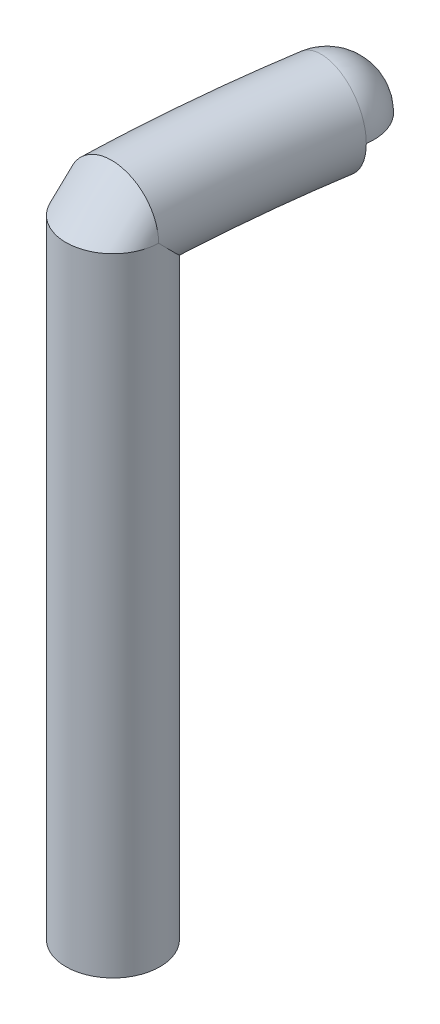
ISO-10303-21;
HEADER;
FILE_DESCRIPTION(('STEP AP214'),'2;1');
FILE_NAME('part.step','',(''),(''),'','','');
FILE_SCHEMA(('AUTOMOTIVE_DESIGN { 1 0 10303 214 1 1 1 1 }'));
ENDSEC;
DATA;
#1=APPLICATION_CONTEXT('core data for automotive mechanical design processes');
#2=APPLICATION_PROTOCOL_DEFINITION('international standard','automotive_design',2000,#1);
#3=PRODUCT_CONTEXT('',#1,'mechanical');
#4=PRODUCT('Part','Part','',(#3));
#5=PRODUCT_RELATED_PRODUCT_CATEGORY('part','',(#4));
#6=PRODUCT_DEFINITION_FORMATION('','',#4);
#7=PRODUCT_DEFINITION_CONTEXT('part definition',#1,'design');
#8=PRODUCT_DEFINITION('design','',#6,#7);
#9=PRODUCT_DEFINITION_SHAPE('','',#8);
#10=(LENGTH_UNIT() NAMED_UNIT(*) SI_UNIT(.MILLI.,.METRE.));
#11=(NAMED_UNIT(*) PLANE_ANGLE_UNIT() SI_UNIT($,.RADIAN.));
#12=(NAMED_UNIT(*) SI_UNIT($,.STERADIAN.) SOLID_ANGLE_UNIT());
#13=UNCERTAINTY_MEASURE_WITH_UNIT(LENGTH_MEASURE(1.E-05),#10,'distance_accuracy_value','');
#14=(GEOMETRIC_REPRESENTATION_CONTEXT(3) GLOBAL_UNCERTAINTY_ASSIGNED_CONTEXT((#13)) GLOBAL_UNIT_ASSIGNED_CONTEXT((#10,
#11,#12)) REPRESENTATION_CONTEXT('',''));
#15=CARTESIAN_POINT('',(0.,0.,0.));
#16=DIRECTION('',(0.,0.,1.));
#17=DIRECTION('',(1.,0.,0.));
#18=AXIS2_PLACEMENT_3D('',#15,#16,#17);
#19=CARTESIAN_POINT('',(0.,10.,0.));
#20=DIRECTION('',(0.,-1.,0.));
#21=DIRECTION('',(0.,0.,-1.));
#22=AXIS2_PLACEMENT_3D('',#19,#20,#21);
#23=CYLINDRICAL_SURFACE('',#22,1.5);
#24=CARTESIAN_POINT('',(-1.49938018439275,10.,-0.0431168487989805));
#25=CARTESIAN_POINT('',(-1.502973255126,10.,0.0818314999004156));
#26=CARTESIAN_POINT('',(-1.49184401753761,10.,0.223609989350335));
#27=CARTESIAN_POINT('',(-1.41111137182391,10.,0.533258564215563));
#28=CARTESIAN_POINT('',(-1.34072554100645,10.,0.701751397357321));
#29=CARTESIAN_POINT('',(-1.11002297258073,10.,1.02851786583561));
#30=CARTESIAN_POINT('',(-0.947978833180463,10.,1.18604361371794));
#31=CARTESIAN_POINT('',(-0.539291073540338,10.,1.41934085398787));
#32=CARTESIAN_POINT('',(-0.29301354619778,10.,1.49219404292625));
#33=CARTESIAN_POINT('',(0.206779848599801,10.,1.50656632585925));
#34=CARTESIAN_POINT('',(0.456836938236157,10.,1.44798595768824));
#35=CARTESIAN_POINT('',(0.878255855076445,10.,1.23855963716862));
#36=CARTESIAN_POINT('',(1.04908449294482,10.,1.09060612810616));
#37=CARTESIAN_POINT('',(1.29818358352478,10.,0.777637051243542));
#38=CARTESIAN_POINT('',(1.37813560586244,10.,0.61346740080803));
#39=CARTESIAN_POINT('',(1.4765289128442,10.,0.308969852145988));
#40=CARTESIAN_POINT('',(1.4957871136595,10.,0.168065197498395));
#41=CARTESIAN_POINT('',(1.49938018439275,10.,0.0431168487989986));
#42=B_SPLINE_CURVE_WITH_KNOTS('',3,(#24,#25,#26,#27,#28,#29,#30,#31,#32,#33,#34,#35,#36,#37,#38,
#39,#40,#41),.UNSPECIFIED.,.F.,.F.,(4,2,2,2,2,2,2,2,4),(0.,0.125,0.25,0.375,0.5,0.625,0.75,
0.875,1.),.UNSPECIFIED.);
#43=CARTESIAN_POINT('',(-1.49938018439275,10.,-0.0431168487989805));
#44=VERTEX_POINT('',#43);
#45=CARTESIAN_POINT('',(1.49938018439275,10.,0.0431168487989985));
#46=VERTEX_POINT('',#45);
#47=EDGE_CURVE('E12',#44,#46,#42,.T.);
#48=ORIENTED_EDGE('',*,*,#47,.F.);
#49=CARTESIAN_POINT('',(-1.49938018439275,10.,-0.0431168487989802));
#50=CARTESIAN_POINT('',(-1.49932652382973,9.99816086927018,-0.0449825910807266));
#51=CARTESIAN_POINT('',(-1.49926938794462,9.99632168364455,-0.0468482892103134));
#52=CARTESIAN_POINT('',(-1.49549142339636,9.88168256425837,-0.163133710811482));
#53=CARTESIAN_POINT('',(-1.4786974992958,9.76870382220539,-0.27735710822467));
#54=CARTESIAN_POINT('',(-1.41831838619842,9.5455356959307,-0.501936867428651));
#55=CARTESIAN_POINT('',(-1.37467520898276,9.43535288806064,-0.612284311273254));
#56=CARTESIAN_POINT('',(-1.27529661106114,9.25225172578073,-0.794424877009568));
#57=CARTESIAN_POINT('',(-1.22649407845322,9.1776225116601,-0.86828120790647));
#58=CARTESIAN_POINT('',(-1.11330591130869,9.03416044994391,-1.0093066300738));
#59=CARTESIAN_POINT('',(-1.04895554375433,8.96531495286826,-1.07649037682112));
#60=CARTESIAN_POINT('',(-0.922635796985833,8.85322260227896,-1.18480188848935));
#61=CARTESIAN_POINT('',(-0.864377072106044,8.80796739089892,-1.22816838688318));
#62=CARTESIAN_POINT('',(-0.738708495724694,8.72416563268223,-1.30759909134616));
#63=CARTESIAN_POINT('',(-0.671310295017772,8.68561068499964,-1.34367245102526));
#64=CARTESIAN_POINT('',(-0.542581246069168,8.62449516455373,-1.39981460654988));
#65=CARTESIAN_POINT('',(-0.482814321599226,8.60027628204208,-1.42164691269252));
#66=CARTESIAN_POINT('',(-0.358719315340889,8.55892977685502,-1.45790533565098));
#67=CARTESIAN_POINT('',(-0.294394346644171,8.54179736784932,-1.47233645294706));
#68=CARTESIAN_POINT('',(-0.16225959568242,8.51578950854917,-1.49270441045903));
#69=CARTESIAN_POINT('',(-0.0944284770467013,8.50697300779367,-1.49858076496475));
#70=CARTESIAN_POINT('',(0.0419642682140081,8.49864396585867,-1.50096045248283));
#71=CARTESIAN_POINT('',(0.110525506350655,8.49912670187407,-1.49746854413218));
#72=CARTESIAN_POINT('',(0.2381149962436,8.5088010184381,-1.48221380833435));
#73=CARTESIAN_POINT('',(0.297342637315855,8.51699883171821,-1.47143378339239));
#74=CARTESIAN_POINT('',(0.412820084821414,8.54015187544153,-1.44329929335211));
#75=CARTESIAN_POINT('',(0.469069448960498,8.55510810642843,-1.42594385486428));
#76=CARTESIAN_POINT('',(0.579457894315535,8.59157232798159,-1.38485587153756));
#77=CARTESIAN_POINT('',(0.633445022195836,8.61329952336927,-1.36091369248996));
#78=CARTESIAN_POINT('',(0.736365435096269,8.66200635163542,-1.30809723241815));
#79=CARTESIAN_POINT('',(0.785296152130478,8.68898863352949,-1.27922046484064));
#80=CARTESIAN_POINT('',(0.903155172535591,8.76310171805772,-1.20070960443533));
#81=CARTESIAN_POINT('',(0.96841770691637,8.81319048145329,-1.148349807482));
#82=CARTESIAN_POINT('',(1.08657806066911,8.92047800200151,-1.03728340316927));
#83=CARTESIAN_POINT('',(1.13944236255088,8.97769540645409,-0.978560204744381));
#84=CARTESIAN_POINT('',(1.2522117150946,9.12069106833198,-0.832772304338706));
#85=CARTESIAN_POINT('',(1.30657880704358,9.20878940463409,-0.74371198235814));
#86=CARTESIAN_POINT('',(1.39473135366095,9.39040017639781,-0.561249099107678));
#87=CARTESIAN_POINT('',(1.42850464628602,9.48391577549859,-0.467844006928321));
#88=CARTESIAN_POINT('',(1.47024065780035,9.64718595403276,-0.305475011407002));
#89=CARTESIAN_POINT('',(1.48277704079542,9.71628453884924,-0.236968577753659));
#90=CARTESIAN_POINT('',(1.49827347453524,9.85509642346358,-0.0996882903030317));
#91=CARTESIAN_POINT('',(1.50125060678697,9.92480840332783,-0.030915133615979));
#92=CARTESIAN_POINT('',(1.49948105705724,9.9963208481422,0.0394947072858357));
#93=CARTESIAN_POINT('',(1.49943225886567,9.99816044146853,0.0413058422906981));
#94=CARTESIAN_POINT('',(1.49938018439279,10.,0.0431168487989818));
#95=B_SPLINE_CURVE_WITH_KNOTS('',3,(#49,#50,#51,#52,#53,#54,#55,#56,#57,#58,#59,#60,#61,#62,#63,
#64,#65,#66,#67,#68,#69,#70,#71,#72,#73,#74,#75,#76,#77,#78,#79,#80,#81,#82,#83,#84,#85,#86,#87,
#88,#89,#90,#91,#92,#93,#94),.UNSPECIFIED.,.F.,.F.,(4,2,2,2,2,2,2,2,2,2,2,2,2,2,2,2,2,2,2,2,2,2,
4),(0.,0.00786130455138146,0.489993896622692,0.973171457872733,1.31940705152447,
1.66486453662568,1.92072982908381,2.17627196397468,2.37972143717495,2.58303327171022,
2.78777573828283,2.99241422500368,3.17384725207606,3.35530714803701,3.54339003226966,
3.73156797299757,4.02247655532376,4.31416274340212,4.72165875324494,5.12939518478898,
5.42328754323168,5.7166544497942,5.72440042274652),.UNSPECIFIED.);
#96=EDGE_CURVE('E77',#44,#46,#95,.T.);
#97=ORIENTED_EDGE('',*,*,#96,.T.);
#98=EDGE_LOOP('',(#48,#97));
#99=FACE_BOUND('',#98,.T.);
#100=CARTESIAN_POINT('',(0.,-10.,0.));
#101=DIRECTION('',(0.,1.,0.));
#102=DIRECTION('',(0.,0.,1.));
#103=AXIS2_PLACEMENT_3D('',#100,#101,#102);
#104=CIRCLE('',#103,1.5);
#105=CARTESIAN_POINT('',(0.,-10.,1.5));
#106=VERTEX_POINT('',#105);
#107=EDGE_CURVE('E50',#106,#106,#104,.T.);
#108=ORIENTED_EDGE('',*,*,#107,.T.);
#109=EDGE_LOOP('',(#108));
#110=FACE_BOUND('',#109,.T.);
#111=ADVANCED_FACE('F39',(#99,#110),#23,.T.);
#112=CARTESIAN_POINT('',(0.,-10.,0.));
#113=DIRECTION('',(0.,1.,0.));
#114=DIRECTION('',(0.,0.,1.));
#115=AXIS2_PLACEMENT_3D('',#112,#113,#114);
#116=PLANE('',#115);
#117=ORIENTED_EDGE('',*,*,#107,.F.);
#118=EDGE_LOOP('',(#117));
#119=FACE_BOUND('',#118,.T.);
#120=ADVANCED_FACE('F143',(#119),#116,.F.);
#121=CARTESIAN_POINT('',(49.979339479784,10.,1.43722829330008));
#122=DIRECTION('',(0.,-1.,0.));
#123=DIRECTION('',(0.,0.,-1.));
#124=AXIS2_PLACEMENT_3D('',#121,#122,#123);
#125=TOROIDAL_SURFACE('',#124,50.0000000000256,1.5);
#126=CARTESIAN_POINT('',(0.574182732501968,10.,-6.25240672918641));
#127=DIRECTION('',(0.153792700449651,0.,-0.988103134945135));
#128=DIRECTION('',(-0.988103134945135,0.,-0.153792700449651));
#129=AXIS2_PLACEMENT_3D('',#126,#127,#128);
#130=CIRCLE('',#129,1.5);
#131=CARTESIAN_POINT('',(-0.907971969915732,10.,-6.48309577986088));
#132=VERTEX_POINT('',#131);
#133=CARTESIAN_POINT('',(2.05633743491967,10.,-6.02171767851194));
#134=VERTEX_POINT('',#133);
#135=EDGE_CURVE('E70',#132,#134,#130,.T.);
#136=ORIENTED_EDGE('',*,*,#135,.F.);
#137=EDGE_CURVE('E73',#134,#132,#130,.T.);
#138=ORIENTED_EDGE('',*,*,#137,.F.);
#139=EDGE_LOOP('',(#136,#138));
#140=FACE_BOUND('',#139,.T.);
#141=ORIENTED_EDGE('',*,*,#96,.F.);
#142=CARTESIAN_POINT('',(1.49938018439275,10.,0.0431168487989986));
#143=CARTESIAN_POINT('',(1.49938018439275,10.125,0.0431168487989986));
#144=CARTESIAN_POINT('',(1.48418646519091,10.2664,0.0426799313978357));
#145=CARTESIAN_POINT('',(1.39462348884318,10.5736,0.0401044182962434));
#146=CARTESIAN_POINT('',(1.31945456226562,10.74,0.0379428269431212));
#147=CARTESIAN_POINT('',(1.07955373276278,11.06,0.0310441311352845));
#148=CARTESIAN_POINT('',(0.913117344128458,11.2128027681661,0.0262580117253494));
#149=CARTESIAN_POINT('',(0.49806400588825,11.4342560553633,0.0143225518501993));
#150=CARTESIAN_POINT('',(0.249896697398792,11.5,0.00718614146651579));
#151=CARTESIAN_POINT('',(-0.249896697398792,11.5,-0.00718614146647751));
#152=CARTESIAN_POINT('',(-0.49806400588825,11.4342560553633,-0.0143225518501611));
#153=CARTESIAN_POINT('',(-0.913117344128459,11.2128027681661,-0.0262580117253113));
#154=CARTESIAN_POINT('',(-1.07955373276278,11.06,-0.0310441311352465));
#155=CARTESIAN_POINT('',(-1.31945456226562,10.74,-0.0379428269430834));
#156=CARTESIAN_POINT('',(-1.39462348884318,10.5736,-0.0401044182962057));
#157=CARTESIAN_POINT('',(-1.48418646519091,10.2664,-0.0426799313977982));
#158=CARTESIAN_POINT('',(-1.49938018439275,10.125,-0.0431168487989612));
#159=CARTESIAN_POINT('',(-1.49938018439275,10.,-0.0431168487989613));
#160=B_SPLINE_CURVE_WITH_KNOTS('',3,(#142,#143,#144,#145,#146,#147,#148,#149,#150,#151,#152,
#153,#154,#155,#156,#157,#158,#159),.UNSPECIFIED.,.F.,.F.,(4,2,2,2,2,2,2,2,4),(0.,0.125,0.25,
0.375,0.5,0.625,0.75,0.875,1.),.UNSPECIFIED.);
#161=EDGE_CURVE('E80',#44,#46,#160,.F.);
#162=ORIENTED_EDGE('',*,*,#161,.T.);
#163=EDGE_LOOP('',(#141,#162));
#164=FACE_BOUND('',#163,.T.);
#165=ADVANCED_FACE('F71',(#140,#164),#125,.T.);
#166=CARTESIAN_POINT('',(0.574182732501968,10.,-6.25240672918641));
#167=DIRECTION('',(0.153792700449651,0.,-0.988103134945135));
#168=DIRECTION('',(-0.988103134945135,0.,-0.153792700449651));
#169=AXIS2_PLACEMENT_3D('',#166,#167,#168);
#170=PLANE('',#169);
#171=DIRECTION('',(-0.988103134945136,0.,-0.153792700449645));
#172=VECTOR('',#171,1.);
#173=CARTESIAN_POINT('',(2.05633743491969,10.,-6.02171767851195));
#174=LINE('',#173,#172);
#175=EDGE_CURVE('E56',#134,#132,#174,.T.);
#176=ORIENTED_EDGE('',*,*,#175,.F.);
#177=ORIENTED_EDGE('',*,*,#137,.T.);
#178=EDGE_LOOP('',(#176,#177));
#179=FACE_BOUND('',#178,.T.);
#180=ADVANCED_FACE('F79',(#179),#170,.T.);
#181=CARTESIAN_POINT('',(-1.49938018439275,10.,-0.0431168487989805));
#182=CARTESIAN_POINT('',(-1.49938018439275,10.,-0.0431168487989613));
#183=CARTESIAN_POINT('',(-1.502973255126,10.,0.0818314999004156));
#184=CARTESIAN_POINT('',(-1.49938018439275,10.125,-0.0431168487989612));
#185=CARTESIAN_POINT('',(-1.49184401753761,10.,0.223609989350335));
#186=CARTESIAN_POINT('',(-1.48418646519091,10.2664,-0.0426799313977982));
#187=CARTESIAN_POINT('',(-1.41111137182391,10.,0.533258564215563));
#188=CARTESIAN_POINT('',(-1.39462348884318,10.5736,-0.0401044182962057));
#189=CARTESIAN_POINT('',(-1.34072554100645,10.,0.701751397357321));
#190=CARTESIAN_POINT('',(-1.31945456226562,10.74,-0.0379428269430834));
#191=CARTESIAN_POINT('',(-1.11002297258073,10.,1.02851786583561));
#192=CARTESIAN_POINT('',(-1.07955373276278,11.06,-0.0310441311352465));
#193=CARTESIAN_POINT('',(-0.947978833180463,10.,1.18604361371794));
#194=CARTESIAN_POINT('',(-0.913117344128459,11.2128027681661,-0.0262580117253113));
#195=CARTESIAN_POINT('',(-0.539291073540338,10.,1.41934085398787));
#196=CARTESIAN_POINT('',(-0.49806400588825,11.4342560553633,-0.0143225518501611));
#197=CARTESIAN_POINT('',(-0.29301354619778,10.,1.49219404292625));
#198=CARTESIAN_POINT('',(-0.249896697398792,11.5,-0.00718614146647751));
#199=CARTESIAN_POINT('',(0.206779848599801,10.,1.50656632585925));
#200=CARTESIAN_POINT('',(0.249896697398792,11.5,0.00718614146651579));
#201=CARTESIAN_POINT('',(0.456836938236157,10.,1.44798595768824));
#202=CARTESIAN_POINT('',(0.49806400588825,11.4342560553633,0.0143225518501993));
#203=CARTESIAN_POINT('',(0.878255855076445,10.,1.23855963716862));
#204=CARTESIAN_POINT('',(0.913117344128458,11.2128027681661,0.0262580117253494));
#205=CARTESIAN_POINT('',(1.04908449294482,10.,1.09060612810616));
#206=CARTESIAN_POINT('',(1.07955373276278,11.06,0.0310441311352845));
#207=CARTESIAN_POINT('',(1.29818358352478,10.,0.777637051243542));
#208=CARTESIAN_POINT('',(1.31945456226562,10.74,0.0379428269431212));
#209=CARTESIAN_POINT('',(1.37813560586244,10.,0.61346740080803));
#210=CARTESIAN_POINT('',(1.39462348884318,10.5736,0.0401044182962434));
#211=CARTESIAN_POINT('',(1.4765289128442,10.,0.308969852145988));
#212=CARTESIAN_POINT('',(1.48418646519091,10.2664,0.0426799313978357));
#213=CARTESIAN_POINT('',(1.4957871136595,10.,0.168065197498395));
#214=CARTESIAN_POINT('',(1.49938018439275,10.125,0.0431168487989986));
#215=CARTESIAN_POINT('',(1.49938018439275,10.,0.0431168487989986));
#216=CARTESIAN_POINT('',(1.49938018439275,10.,0.0431168487989986));
#217=B_SPLINE_SURFACE_WITH_KNOTS('',3,1,((#181,#182),(#183,#184),(#185,#186),(#187,#188),(#189,
#190),(#191,#192),(#193,#194),(#195,#196),(#197,#198),(#199,#200),(#201,#202),(#203,#204),(#205,
#206),(#207,#208),(#209,#210),(#211,#212),(#213,#214),(#215,#216)),.UNSPECIFIED.,.F.,.F.,.F.,(4,
2,2,2,2,2,2,2,4),(2,2),(0.,0.125,0.25,0.375,0.5,0.625,0.75,0.875,1.),(0.,1.),.UNSPECIFIED.);
#218=ORIENTED_EDGE('',*,*,#47,.T.);
#219=ORIENTED_EDGE('',*,*,#161,.F.);
#220=EDGE_LOOP('',(#218,#219));
#221=FACE_BOUND('',#220,.T.);
#222=ADVANCED_FACE('F93',(#221),#217,.T.);
#223=CARTESIAN_POINT('',(0.574182732501979,10.,-6.25240672918641));
#224=DIRECTION('',(-0.988103134945136,0.,-0.153792700449645));
#225=DIRECTION('',(0.,1.,0.));
#226=AXIS2_PLACEMENT_3D('',#223,#224,#225);
#227=SPHERICAL_SURFACE('',#226,1.50000000000001);
#228=CARTESIAN_POINT('',(0.574182732501979,10.,-6.25240672918642));
#229=DIRECTION('',(0.,-1.,0.));
#230=DIRECTION('',(0.,0.,-1.));
#231=AXIS2_PLACEMENT_3D('',#228,#229,#230);
#232=CIRCLE('',#231,1.50000000000001);
#233=EDGE_CURVE('E81',#132,#134,#232,.T.);
#234=ORIENTED_EDGE('',*,*,#233,.F.);
#235=ORIENTED_EDGE('',*,*,#135,.T.);
#236=EDGE_LOOP('',(#234,#235));
#237=FACE_BOUND('',#236,.T.);
#238=ADVANCED_FACE('F82',(#237),#227,.T.);
#239=CARTESIAN_POINT('',(0.574182732501979,10.,-6.25240672918642));
#240=DIRECTION('',(0.,-1.,0.));
#241=DIRECTION('',(0.,0.,-1.));
#242=AXIS2_PLACEMENT_3D('',#239,#240,#241);
#243=PLANE('',#242);
#244=ORIENTED_EDGE('',*,*,#233,.T.);
#245=ORIENTED_EDGE('',*,*,#175,.T.);
#246=EDGE_LOOP('',(#244,#245));
#247=FACE_BOUND('',#246,.T.);
#248=ADVANCED_FACE('F85',(#247),#243,.T.);
#249=CLOSED_SHELL('',(#111,#120,#165,#180,#222,#238,#248));
#250=MANIFOLD_SOLID_BREP('B2',#249);
#251=ADVANCED_BREP_SHAPE_REPRESENTATION('',(#18,#250),#14);
#252=SHAPE_DEFINITION_REPRESENTATION(#9,#251);
ENDSEC;
END-ISO-10303-21;
